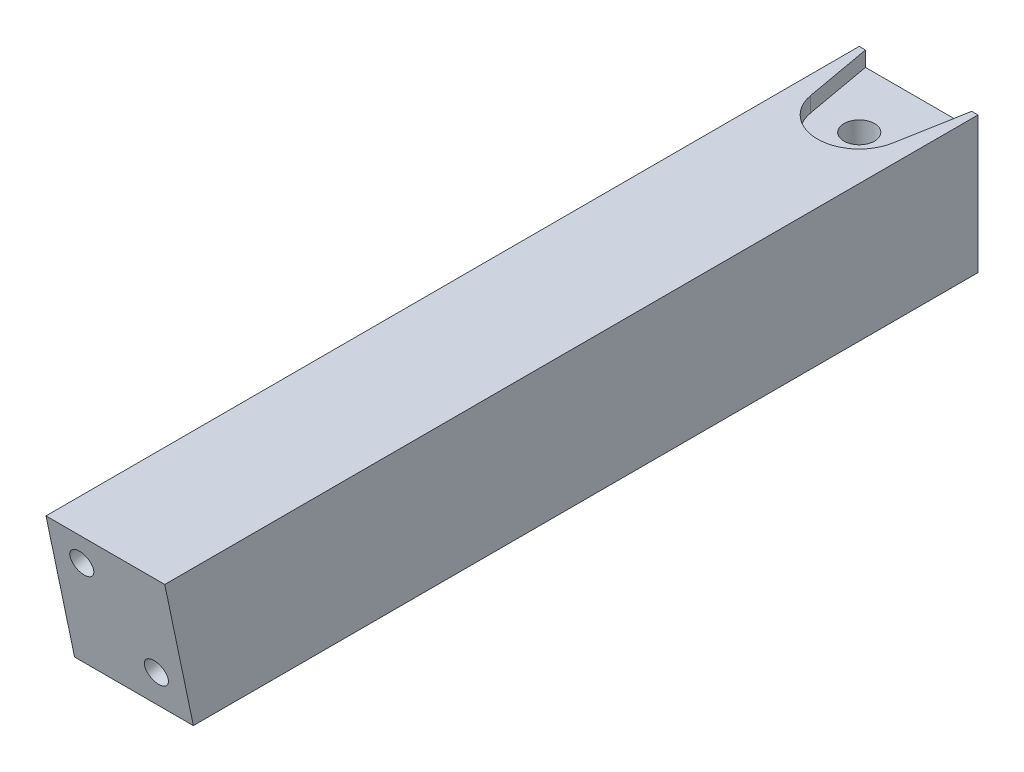
ISO-10303-21;
HEADER;
FILE_DESCRIPTION(('STEP AP214'),'2;1');
FILE_NAME('part.step','',(''),(''),'','','');
FILE_SCHEMA(('AUTOMOTIVE_DESIGN { 1 0 10303 214 1 1 1 1 }'));
ENDSEC;
DATA;
#1=APPLICATION_CONTEXT('core data for automotive mechanical design processes');
#2=APPLICATION_PROTOCOL_DEFINITION('international standard','automotive_design',2000,#1);
#3=PRODUCT_CONTEXT('',#1,'mechanical');
#4=PRODUCT('Part','Part','',(#3));
#5=PRODUCT_RELATED_PRODUCT_CATEGORY('part','',(#4));
#6=PRODUCT_DEFINITION_FORMATION('','',#4);
#7=PRODUCT_DEFINITION_CONTEXT('part definition',#1,'design');
#8=PRODUCT_DEFINITION('design','',#6,#7);
#9=PRODUCT_DEFINITION_SHAPE('','',#8);
#10=(LENGTH_UNIT() NAMED_UNIT(*) SI_UNIT(.MILLI.,.METRE.));
#11=(NAMED_UNIT(*) PLANE_ANGLE_UNIT() SI_UNIT($,.RADIAN.));
#12=(NAMED_UNIT(*) SI_UNIT($,.STERADIAN.) SOLID_ANGLE_UNIT());
#13=UNCERTAINTY_MEASURE_WITH_UNIT(LENGTH_MEASURE(1.E-05),#10,'distance_accuracy_value','');
#14=(GEOMETRIC_REPRESENTATION_CONTEXT(3) GLOBAL_UNCERTAINTY_ASSIGNED_CONTEXT((#13)) GLOBAL_UNIT_ASSIGNED_CONTEXT((#10,
#11,#12)) REPRESENTATION_CONTEXT('',''));
#15=CARTESIAN_POINT('',(0.,0.,0.));
#16=DIRECTION('',(0.,0.,1.));
#17=DIRECTION('',(1.,0.,0.));
#18=AXIS2_PLACEMENT_3D('',#15,#16,#17);
#19=CARTESIAN_POINT('',(12.7,14.605,197.296101601284));
#20=DIRECTION('',(0.,1.,0.));
#21=DIRECTION('',(-1.,0.,0.));
#22=AXIS2_PLACEMENT_3D('',#19,#20,#21);
#23=PLANE('',#22);
#24=DIRECTION('',(-0.176771623019133,0.,-0.984251895245918));
#25=VECTOR('',#24,1.);
#26=CARTESIAN_POINT('',(25.9239685293045,14.605,194.921077086757));
#27=LINE('',#26,#25);
#28=CARTESIAN_POINT('',(-8.7999993450147,14.605,1.58047972708946));
#29=VERTEX_POINT('',#28);
#30=CARTESIAN_POINT('',(-11.3647732520222,14.605,-12.7));
#31=VERTEX_POINT('',#30);
#32=EDGE_CURVE('E172',#29,#31,#27,.T.);
#33=ORIENTED_EDGE('',*,*,#32,.T.);
#34=DIRECTION('',(-1.,0.,0.));
#35=VECTOR('',#34,1.);
#36=CARTESIAN_POINT('',(12.7,14.605,-12.7));
#37=LINE('',#36,#35);
#38=CARTESIAN_POINT('',(-12.7,14.605,-12.7));
#39=VERTEX_POINT('',#38);
#40=EDGE_CURVE('E195',#31,#39,#37,.T.);
#41=ORIENTED_EDGE('',*,*,#40,.T.);
#42=DIRECTION('',(0.,0.,-1.));
#43=VECTOR('',#42,1.);
#44=CARTESIAN_POINT('',(-12.7,14.605,197.296101601284));
#45=LINE('',#44,#43);
#46=CARTESIAN_POINT('',(-12.7,14.605,161.22573442005));
#47=VERTEX_POINT('',#46);
#48=EDGE_CURVE('E207',#47,#39,#45,.T.);
#49=ORIENTED_EDGE('',*,*,#48,.F.);
#50=DIRECTION('',(-1.,0.,0.));
#51=VECTOR('',#50,1.);
#52=CARTESIAN_POINT('',(12.7,14.605,161.22573442005));
#53=LINE('',#52,#51);
#54=CARTESIAN_POINT('',(12.7,14.605,161.22573442005));
#55=VERTEX_POINT('',#54);
#56=EDGE_CURVE('E208',#55,#47,#53,.T.);
#57=ORIENTED_EDGE('',*,*,#56,.F.);
#58=DIRECTION('',(0.,0.,-1.));
#59=VECTOR('',#58,1.);
#60=CARTESIAN_POINT('',(12.7,14.605,197.296101601284));
#61=LINE('',#60,#59);
#62=CARTESIAN_POINT('',(12.7,14.605,-12.7));
#63=VERTEX_POINT('',#62);
#64=EDGE_CURVE('E211',#55,#63,#61,.T.);
#65=ORIENTED_EDGE('',*,*,#64,.T.);
#66=CARTESIAN_POINT('',(11.3647732520222,14.605,-12.7));
#67=VERTEX_POINT('',#66);
#68=EDGE_CURVE('E196',#63,#67,#37,.T.);
#69=ORIENTED_EDGE('',*,*,#68,.T.);
#70=DIRECTION('',(0.176771623019133,0.,-0.984251895245918));
#71=VECTOR('',#70,1.);
#72=CARTESIAN_POINT('',(-25.1302640790021,14.605,190.501786840207));
#73=LINE('',#72,#71);
#74=CARTESIAN_POINT('',(8.7999993450147,14.605,1.58047972708946));
#75=VERTEX_POINT('',#74);
#76=EDGE_CURVE('E164',#75,#67,#73,.T.);
#77=ORIENTED_EDGE('',*,*,#76,.F.);
#78=CARTESIAN_POINT('',(0.,14.605,0.));
#79=DIRECTION('',(0.,-1.,0.));
#80=DIRECTION('',(-1.,0.,0.));
#81=AXIS2_PLACEMENT_3D('',#78,#79,#80);
#82=CIRCLE('',#81,8.9408);
#83=EDGE_CURVE('E229',#29,#75,#82,.F.);
#84=ORIENTED_EDGE('',*,*,#83,.F.);
#85=EDGE_LOOP('',(#33,#41,#49,#57,#65,#69,#77,#84));
#86=FACE_BOUND('',#85,.T.);
#87=ADVANCED_FACE('F41',(#86),#23,.T.);
#88=CARTESIAN_POINT('',(233.303265585854,1008.96652745467,369.453578742917));
#89=DIRECTION('',(0.,-0.204962795312324,0.97876976482611));
#90=DIRECTION('',(0.,0.97876976482611,0.204962795312324));
#91=AXIS2_PLACEMENT_3D('',#88,#89,#90);
#92=PLANE('',#91);
#93=CARTESIAN_POINT('',(-6.35,8.3898119933542,159.924220669817));
#94=DIRECTION('',(0.,0.204962795312324,-0.97876976482611));
#95=DIRECTION('',(0.,0.97876976482611,0.204962795312324));
#96=AXIS2_PLACEMENT_3D('',#93,#94,#95);
#97=CIRCLE('',#96,2.52729999999989);
#98=CARTESIAN_POINT('',(-6.35,10.8634568199991,160.442223142409));
#99=VERTEX_POINT('',#98);
#100=EDGE_CURVE('E180',#99,#99,#97,.T.);
#101=ORIENTED_EDGE('',*,*,#100,.T.);
#102=EDGE_LOOP('',(#101));
#103=FACE_BOUND('',#102,.T.);
#104=CARTESIAN_POINT('',(6.35,-7.14815802326029,156.670436294233));
#105=DIRECTION('',(0.,0.204962795312324,-0.97876976482611));
#106=DIRECTION('',(0.,0.97876976482611,0.204962795312324));
#107=AXIS2_PLACEMENT_3D('',#104,#105,#106);
#108=CIRCLE('',#107,2.52729999999989);
#109=CARTESIAN_POINT('',(6.35,-4.67451319661537,157.188438766826));
#110=VERTEX_POINT('',#109);
#111=EDGE_CURVE('E183',#110,#110,#108,.T.);
#112=ORIENTED_EDGE('',*,*,#111,.T.);
#113=EDGE_LOOP('',(#112));
#114=FACE_BOUND('',#113,.T.);
#115=DIRECTION('',(0.,-0.97876976482611,-0.204962795312324));
#116=VECTOR('',#115,1.);
#117=CARTESIAN_POINT('',(-12.7,21.8411263885984,162.741041436204));
#118=LINE('',#117,#116);
#119=CARTESIAN_POINT('',(-12.7,-14.605,155.108909538218));
#120=VERTEX_POINT('',#119);
#121=EDGE_CURVE('E203',#47,#120,#118,.T.);
#122=ORIENTED_EDGE('',*,*,#121,.T.);
#123=DIRECTION('',(1.,0.,0.));
#124=VECTOR('',#123,1.);
#125=CARTESIAN_POINT('',(12.7,-14.605,155.108909538218));
#126=LINE('',#125,#124);
#127=CARTESIAN_POINT('',(12.7,-14.605,155.108909538218));
#128=VERTEX_POINT('',#127);
#129=EDGE_CURVE('E199',#120,#128,#126,.T.);
#130=ORIENTED_EDGE('',*,*,#129,.T.);
#131=DIRECTION('',(0.,0.97876976482611,0.204962795312324));
#132=VECTOR('',#131,1.);
#133=CARTESIAN_POINT('',(12.7,21.8411263885984,162.741041436204));
#134=LINE('',#133,#132);
#135=EDGE_CURVE('E212',#128,#55,#134,.T.);
#136=ORIENTED_EDGE('',*,*,#135,.T.);
#137=ORIENTED_EDGE('',*,*,#56,.T.);
#138=EDGE_LOOP('',(#122,#130,#136,#137));
#139=FACE_BOUND('',#138,.T.);
#140=ADVANCED_FACE('F43',(#103,#114,#139),#92,.T.);
#141=CARTESIAN_POINT('',(12.7,-14.605,197.296101601284));
#142=DIRECTION('',(0.,-1.,0.));
#143=DIRECTION('',(1.,0.,0.));
#144=AXIS2_PLACEMENT_3D('',#141,#142,#143);
#145=PLANE('',#144);
#146=DIRECTION('',(0.176771623019133,0.,-0.984251895245918));
#147=VECTOR('',#146,1.);
#148=CARTESIAN_POINT('',(-25.1302640790021,-14.605,190.501786840207));
#149=LINE('',#148,#147);
#150=CARTESIAN_POINT('',(8.7999993450147,-14.605,1.58047972708946));
#151=VERTEX_POINT('',#150);
#152=CARTESIAN_POINT('',(11.3647732520222,-14.605,-12.7));
#153=VERTEX_POINT('',#152);
#154=EDGE_CURVE('E133',#151,#153,#149,.T.);
#155=ORIENTED_EDGE('',*,*,#154,.T.);
#156=DIRECTION('',(1.,0.,0.));
#157=VECTOR('',#156,1.);
#158=CARTESIAN_POINT('',(12.7,-14.605,-12.7));
#159=LINE('',#158,#157);
#160=CARTESIAN_POINT('',(12.7,-14.605,-12.7));
#161=VERTEX_POINT('',#160);
#162=EDGE_CURVE('E189',#153,#161,#159,.T.);
#163=ORIENTED_EDGE('',*,*,#162,.T.);
#164=DIRECTION('',(0.,0.,-1.));
#165=VECTOR('',#164,1.);
#166=CARTESIAN_POINT('',(12.7,-14.605,197.296101601284));
#167=LINE('',#166,#165);
#168=EDGE_CURVE('E202',#128,#161,#167,.T.);
#169=ORIENTED_EDGE('',*,*,#168,.F.);
#170=ORIENTED_EDGE('',*,*,#129,.F.);
#171=DIRECTION('',(0.,0.,-1.));
#172=VECTOR('',#171,1.);
#173=CARTESIAN_POINT('',(-12.7,-14.605,197.296101601284));
#174=LINE('',#173,#172);
#175=CARTESIAN_POINT('',(-12.7,-14.605,-12.7));
#176=VERTEX_POINT('',#175);
#177=EDGE_CURVE('E206',#120,#176,#174,.T.);
#178=ORIENTED_EDGE('',*,*,#177,.T.);
#179=CARTESIAN_POINT('',(-11.3647732520222,-14.605,-12.7));
#180=VERTEX_POINT('',#179);
#181=EDGE_CURVE('E190',#176,#180,#159,.T.);
#182=ORIENTED_EDGE('',*,*,#181,.T.);
#183=DIRECTION('',(-0.176771623019133,0.,-0.984251895245918));
#184=VECTOR('',#183,1.);
#185=CARTESIAN_POINT('',(25.9239685293045,-14.605,194.921077086757));
#186=LINE('',#185,#184);
#187=CARTESIAN_POINT('',(-8.7999993450147,-14.605,1.58047972708946));
#188=VERTEX_POINT('',#187);
#189=EDGE_CURVE('E136',#188,#180,#186,.T.);
#190=ORIENTED_EDGE('',*,*,#189,.F.);
#191=CARTESIAN_POINT('',(0.,-14.605,0.));
#192=DIRECTION('',(0.,1.,0.));
#193=DIRECTION('',(1.,0.,0.));
#194=AXIS2_PLACEMENT_3D('',#191,#192,#193);
#195=CIRCLE('',#194,8.9408);
#196=EDGE_CURVE('E11',#188,#151,#195,.T.);
#197=ORIENTED_EDGE('',*,*,#196,.T.);
#198=EDGE_LOOP('',(#155,#163,#169,#170,#178,#182,#190,#197));
#199=FACE_BOUND('',#198,.T.);
#200=ADVANCED_FACE('F241',(#199),#145,.T.);
#201=CARTESIAN_POINT('',(12.7,14.605,197.296101601284));
#202=DIRECTION('',(1.,0.,0.));
#203=DIRECTION('',(0.,1.,0.));
#204=AXIS2_PLACEMENT_3D('',#201,#202,#203);
#205=PLANE('',#204);
#206=ORIENTED_EDGE('',*,*,#168,.T.);
#207=DIRECTION('',(0.,1.,0.));
#208=VECTOR('',#207,1.);
#209=CARTESIAN_POINT('',(12.7,14.605,-12.7));
#210=LINE('',#209,#208);
#211=EDGE_CURVE('E193',#161,#63,#210,.T.);
#212=ORIENTED_EDGE('',*,*,#211,.T.);
#213=ORIENTED_EDGE('',*,*,#64,.F.);
#214=ORIENTED_EDGE('',*,*,#135,.F.);
#215=EDGE_LOOP('',(#206,#212,#213,#214));
#216=FACE_BOUND('',#215,.T.);
#217=ADVANCED_FACE('F272',(#216),#205,.T.);
#218=CARTESIAN_POINT('',(-12.7,14.605,197.296101601284));
#219=DIRECTION('',(-1.,0.,0.));
#220=DIRECTION('',(0.,-1.,0.));
#221=AXIS2_PLACEMENT_3D('',#218,#219,#220);
#222=PLANE('',#221);
#223=ORIENTED_EDGE('',*,*,#48,.T.);
#224=DIRECTION('',(0.,-1.,0.));
#225=VECTOR('',#224,1.);
#226=CARTESIAN_POINT('',(-12.7,14.605,-12.7));
#227=LINE('',#226,#225);
#228=EDGE_CURVE('E179',#39,#176,#227,.T.);
#229=ORIENTED_EDGE('',*,*,#228,.T.);
#230=ORIENTED_EDGE('',*,*,#177,.F.);
#231=ORIENTED_EDGE('',*,*,#121,.F.);
#232=EDGE_LOOP('',(#223,#229,#230,#231));
#233=FACE_BOUND('',#232,.T.);
#234=ADVANCED_FACE('F250',(#233),#222,.T.);
#235=CARTESIAN_POINT('',(0.,0.,-12.7));
#236=DIRECTION('',(0.,0.,1.));
#237=DIRECTION('',(-1.,0.,0.));
#238=AXIS2_PLACEMENT_3D('',#235,#236,#237);
#239=PLANE('',#238);
#240=DIRECTION('',(1.,0.,0.));
#241=VECTOR('',#240,1.);
#242=CARTESIAN_POINT('',(0.,-11.3792,-12.7));
#243=LINE('',#242,#241);
#244=CARTESIAN_POINT('',(-11.3647732520222,-11.3792,-12.7));
#245=VERTEX_POINT('',#244);
#246=CARTESIAN_POINT('',(11.3647732520222,-11.3792,-12.7));
#247=VERTEX_POINT('',#246);
#248=EDGE_CURVE('E149',#245,#247,#243,.T.);
#249=ORIENTED_EDGE('',*,*,#248,.F.);
#250=DIRECTION('',(0.,-1.,0.));
#251=VECTOR('',#250,1.);
#252=CARTESIAN_POINT('',(-11.3647732520222,0.,-12.7));
#253=LINE('',#252,#251);
#254=EDGE_CURVE('E233',#245,#180,#253,.T.);
#255=ORIENTED_EDGE('',*,*,#254,.T.);
#256=ORIENTED_EDGE('',*,*,#181,.F.);
#257=ORIENTED_EDGE('',*,*,#228,.F.);
#258=ORIENTED_EDGE('',*,*,#40,.F.);
#259=DIRECTION('',(0.,1.,0.));
#260=VECTOR('',#259,1.);
#261=CARTESIAN_POINT('',(-11.3647732520222,0.,-12.7));
#262=LINE('',#261,#260);
#263=CARTESIAN_POINT('',(-11.3647732520222,11.3792,-12.7));
#264=VERTEX_POINT('',#263);
#265=EDGE_CURVE('E227',#264,#31,#262,.T.);
#266=ORIENTED_EDGE('',*,*,#265,.F.);
#267=DIRECTION('',(1.,0.,0.));
#268=VECTOR('',#267,1.);
#269=CARTESIAN_POINT('',(0.,11.3792,-12.7));
#270=LINE('',#269,#268);
#271=CARTESIAN_POINT('',(11.3647732520222,11.3792,-12.7));
#272=VERTEX_POINT('',#271);
#273=EDGE_CURVE('E222',#264,#272,#270,.T.);
#274=ORIENTED_EDGE('',*,*,#273,.T.);
#275=DIRECTION('',(0.,1.,0.));
#276=VECTOR('',#275,1.);
#277=CARTESIAN_POINT('',(11.3647732520222,0.,-12.7));
#278=LINE('',#277,#276);
#279=EDGE_CURVE('E225',#272,#67,#278,.T.);
#280=ORIENTED_EDGE('',*,*,#279,.T.);
#281=ORIENTED_EDGE('',*,*,#68,.F.);
#282=ORIENTED_EDGE('',*,*,#211,.F.);
#283=ORIENTED_EDGE('',*,*,#162,.F.);
#284=DIRECTION('',(0.,-1.,0.));
#285=VECTOR('',#284,1.);
#286=CARTESIAN_POINT('',(11.3647732520222,0.,-12.7));
#287=LINE('',#286,#285);
#288=EDGE_CURVE('E50',#247,#153,#287,.T.);
#289=ORIENTED_EDGE('',*,*,#288,.F.);
#290=EDGE_LOOP('',(#249,#255,#256,#257,#258,#266,#274,#280,#281,#282,#283,#289));
#291=FACE_BOUND('',#290,.T.);
#292=ADVANCED_FACE('F238',(#291),#239,.F.);
#293=CARTESIAN_POINT('',(6.35000000000002,-3.89437364767715,141.132466277619));
#294=DIRECTION('',(0.,-0.204962795312324,0.97876976482611));
#295=DIRECTION('',(0.,0.97876976482611,0.204962795312324));
#296=AXIS2_PLACEMENT_3D('',#293,#294,#295);
#297=CYLINDRICAL_SURFACE('',#296,2.52729999999989);
#298=CARTESIAN_POINT('',(6.35000000000002,-3.89437364767715,141.132466277619));
#299=DIRECTION('',(0.,0.204962795312324,-0.97876976482611));
#300=DIRECTION('',(0.,0.97876976482611,0.204962795312324));
#301=AXIS2_PLACEMENT_3D('',#298,#299,#300);
#302=CIRCLE('',#301,2.52729999999989);
#303=CARTESIAN_POINT('',(6.35000000000002,-1.42072882103223,141.650468750212));
#304=VERTEX_POINT('',#303);
#305=EDGE_CURVE('E175',#304,#304,#302,.T.);
#306=ORIENTED_EDGE('',*,*,#305,.T.);
#307=EDGE_LOOP('',(#306));
#308=FACE_BOUND('',#307,.T.);
#309=ORIENTED_EDGE('',*,*,#111,.F.);
#310=EDGE_LOOP('',(#309));
#311=FACE_BOUND('',#310,.T.);
#312=ADVANCED_FACE('F285',(#308,#311),#297,.F.);
#313=CARTESIAN_POINT('',(6.35000000000002,-3.89437364767715,141.132466277619));
#314=DIRECTION('',(0.,-0.204962795312324,0.97876976482611));
#315=DIRECTION('',(0.,0.97876976482611,0.204962795312324));
#316=AXIS2_PLACEMENT_3D('',#313,#314,#315);
#317=PLANE('',#316);
#318=ORIENTED_EDGE('',*,*,#305,.F.);
#319=EDGE_LOOP('',(#318));
#320=FACE_BOUND('',#319,.T.);
#321=ADVANCED_FACE('F287',(#320),#317,.T.);
#322=CARTESIAN_POINT('',(-6.34999999999999,11.6435963689373,144.386250653202));
#323=DIRECTION('',(0.,-0.204962795312324,0.97876976482611));
#324=DIRECTION('',(0.,0.97876976482611,0.204962795312324));
#325=AXIS2_PLACEMENT_3D('',#322,#323,#324);
#326=CYLINDRICAL_SURFACE('',#325,2.52729999999989);
#327=CARTESIAN_POINT('',(-6.34999999999999,11.6435963689373,144.386250653202));
#328=DIRECTION('',(0.,0.204962795312324,-0.97876976482611));
#329=DIRECTION('',(0.,0.97876976482611,0.204962795312324));
#330=AXIS2_PLACEMENT_3D('',#327,#328,#329);
#331=CIRCLE('',#330,2.52729999999989);
#332=CARTESIAN_POINT('',(-6.34999999999999,14.1172411955823,144.904253125795));
#333=VERTEX_POINT('',#332);
#334=EDGE_CURVE('E176',#333,#333,#331,.T.);
#335=ORIENTED_EDGE('',*,*,#334,.T.);
#336=EDGE_LOOP('',(#335));
#337=FACE_BOUND('',#336,.T.);
#338=ORIENTED_EDGE('',*,*,#100,.F.);
#339=EDGE_LOOP('',(#338));
#340=FACE_BOUND('',#339,.T.);
#341=ADVANCED_FACE('F294',(#337,#340),#326,.F.);
#342=CARTESIAN_POINT('',(-6.34999999999999,11.6435963689373,144.386250653202));
#343=DIRECTION('',(0.,-0.204962795312324,0.97876976482611));
#344=DIRECTION('',(0.,0.97876976482611,0.204962795312324));
#345=AXIS2_PLACEMENT_3D('',#342,#343,#344);
#346=PLANE('',#345);
#347=ORIENTED_EDGE('',*,*,#334,.F.);
#348=EDGE_LOOP('',(#347));
#349=FACE_BOUND('',#348,.T.);
#350=ADVANCED_FACE('F340',(#349),#346,.T.);
#351=CARTESIAN_POINT('',(0.,11.3792,0.));
#352=DIRECTION('',(0.,1.,0.));
#353=DIRECTION('',(0.,0.,1.));
#354=AXIS2_PLACEMENT_3D('',#351,#352,#353);
#355=PLANE('',#354);
#356=CARTESIAN_POINT('',(0.,11.3792,0.));
#357=DIRECTION('',(0.,-1.,0.));
#358=DIRECTION('',(0.,0.,-1.));
#359=AXIS2_PLACEMENT_3D('',#356,#357,#358);
#360=CIRCLE('',#359,3.2639);
#361=CARTESIAN_POINT('',(-3.2639,11.3792,0.));
#362=VERTEX_POINT('',#361);
#363=EDGE_CURVE('E155',#362,#362,#360,.T.);
#364=ORIENTED_EDGE('',*,*,#363,.T.);
#365=EDGE_LOOP('',(#364));
#366=FACE_BOUND('',#365,.T.);
#367=ORIENTED_EDGE('',*,*,#273,.F.);
#368=DIRECTION('',(-0.176771623019133,0.,-0.984251895245918));
#369=VECTOR('',#368,1.);
#370=CARTESIAN_POINT('',(-8.7999993450147,11.3792,1.58047972708946));
#371=LINE('',#370,#369);
#372=CARTESIAN_POINT('',(-8.7999993450147,11.3792,1.58047972708946));
#373=VERTEX_POINT('',#372);
#374=EDGE_CURVE('E65',#373,#264,#371,.T.);
#375=ORIENTED_EDGE('',*,*,#374,.F.);
#376=CARTESIAN_POINT('',(0.,11.3792,0.));
#377=DIRECTION('',(0.,-1.,0.));
#378=DIRECTION('',(0.,0.,-1.));
#379=AXIS2_PLACEMENT_3D('',#376,#377,#378);
#380=CIRCLE('',#379,8.9408);
#381=CARTESIAN_POINT('',(8.7999993450147,11.3792,1.58047972708946));
#382=VERTEX_POINT('',#381);
#383=EDGE_CURVE('E159',#373,#382,#380,.F.);
#384=ORIENTED_EDGE('',*,*,#383,.T.);
#385=DIRECTION('',(0.176771623019133,0.,-0.984251895245918));
#386=VECTOR('',#385,1.);
#387=CARTESIAN_POINT('',(8.7999993450147,11.3792,1.58047972708946));
#388=LINE('',#387,#386);
#389=EDGE_CURVE('E162',#382,#272,#388,.T.);
#390=ORIENTED_EDGE('',*,*,#389,.T.);
#391=EDGE_LOOP('',(#367,#375,#384,#390));
#392=FACE_BOUND('',#391,.T.);
#393=ADVANCED_FACE('F264',(#366,#392),#355,.T.);
#394=CARTESIAN_POINT('',(-8.7999993450147,14.605,1.58047972708946));
#395=DIRECTION('',(-0.984251895245918,0.,0.176771623019133));
#396=DIRECTION('',(0.176771623019133,0.,0.984251895245918));
#397=AXIS2_PLACEMENT_3D('',#394,#395,#396);
#398=PLANE('',#397);
#399=ORIENTED_EDGE('',*,*,#32,.F.);
#400=DIRECTION('',(0.,-1.,0.));
#401=VECTOR('',#400,1.);
#402=CARTESIAN_POINT('',(-8.7999993450147,14.605,1.58047972708946));
#403=LINE('',#402,#401);
#404=EDGE_CURVE('E160',#29,#373,#403,.T.);
#405=ORIENTED_EDGE('',*,*,#404,.T.);
#406=ORIENTED_EDGE('',*,*,#374,.T.);
#407=ORIENTED_EDGE('',*,*,#265,.T.);
#408=EDGE_LOOP('',(#399,#405,#406,#407));
#409=FACE_BOUND('',#408,.T.);
#410=ADVANCED_FACE('F258',(#409),#398,.F.);
#411=CARTESIAN_POINT('',(0.,14.605,0.));
#412=DIRECTION('',(0.,-1.,0.));
#413=DIRECTION('',(0.,0.,-1.));
#414=AXIS2_PLACEMENT_3D('',#411,#412,#413);
#415=CYLINDRICAL_SURFACE('',#414,8.9408);
#416=ORIENTED_EDGE('',*,*,#404,.F.);
#417=ORIENTED_EDGE('',*,*,#83,.T.);
#418=DIRECTION('',(0.,-1.,0.));
#419=VECTOR('',#418,1.);
#420=CARTESIAN_POINT('',(8.7999993450147,14.605,1.58047972708946));
#421=LINE('',#420,#419);
#422=EDGE_CURVE('E165',#75,#382,#421,.T.);
#423=ORIENTED_EDGE('',*,*,#422,.T.);
#424=ORIENTED_EDGE('',*,*,#383,.F.);
#425=EDGE_LOOP('',(#416,#417,#423,#424));
#426=FACE_BOUND('',#425,.T.);
#427=ADVANCED_FACE('F261',(#426),#415,.F.);
#428=CARTESIAN_POINT('',(8.7999993450147,14.605,1.58047972708946));
#429=DIRECTION('',(-0.984251895245918,0.,-0.176771623019133));
#430=DIRECTION('',(-0.176771623019133,0.,0.984251895245918));
#431=AXIS2_PLACEMENT_3D('',#428,#429,#430);
#432=PLANE('',#431);
#433=ORIENTED_EDGE('',*,*,#422,.F.);
#434=ORIENTED_EDGE('',*,*,#76,.T.);
#435=ORIENTED_EDGE('',*,*,#279,.F.);
#436=ORIENTED_EDGE('',*,*,#389,.F.);
#437=EDGE_LOOP('',(#433,#434,#435,#436));
#438=FACE_BOUND('',#437,.T.);
#439=ADVANCED_FACE('F267',(#438),#432,.T.);
#440=CARTESIAN_POINT('',(0.,-11.3792,0.));
#441=DIRECTION('',(0.,1.,0.));
#442=DIRECTION('',(0.,0.,1.));
#443=AXIS2_PLACEMENT_3D('',#440,#441,#442);
#444=PLANE('',#443);
#445=CARTESIAN_POINT('',(0.,-11.3792,0.));
#446=DIRECTION('',(0.,-1.,0.));
#447=DIRECTION('',(0.,0.,-1.));
#448=AXIS2_PLACEMENT_3D('',#445,#446,#447);
#449=CIRCLE('',#448,3.2639);
#450=CARTESIAN_POINT('',(-3.2639,-11.3792,0.));
#451=VERTEX_POINT('',#450);
#452=EDGE_CURVE('E45',#451,#451,#449,.T.);
#453=ORIENTED_EDGE('',*,*,#452,.F.);
#454=EDGE_LOOP('',(#453));
#455=FACE_BOUND('',#454,.T.);
#456=DIRECTION('',(-0.176771623019133,0.,-0.984251895245918));
#457=VECTOR('',#456,1.);
#458=CARTESIAN_POINT('',(-8.7999993450147,-11.3792,1.58047972708946));
#459=LINE('',#458,#457);
#460=CARTESIAN_POINT('',(-8.7999993450147,-11.3792,1.58047972708946));
#461=VERTEX_POINT('',#460);
#462=EDGE_CURVE('E144',#461,#245,#459,.T.);
#463=ORIENTED_EDGE('',*,*,#462,.T.);
#464=ORIENTED_EDGE('',*,*,#248,.T.);
#465=DIRECTION('',(0.176771623019133,0.,-0.984251895245918));
#466=VECTOR('',#465,1.);
#467=CARTESIAN_POINT('',(8.7999993450147,-11.3792,1.58047972708946));
#468=LINE('',#467,#466);
#469=CARTESIAN_POINT('',(8.7999993450147,-11.3792,1.58047972708946));
#470=VERTEX_POINT('',#469);
#471=EDGE_CURVE('E57',#470,#247,#468,.T.);
#472=ORIENTED_EDGE('',*,*,#471,.F.);
#473=CARTESIAN_POINT('',(0.,-11.3792,0.));
#474=DIRECTION('',(0.,-1.,0.));
#475=DIRECTION('',(0.,0.,-1.));
#476=AXIS2_PLACEMENT_3D('',#473,#474,#475);
#477=CIRCLE('',#476,8.9408);
#478=EDGE_CURVE('E140',#461,#470,#477,.F.);
#479=ORIENTED_EDGE('',*,*,#478,.F.);
#480=EDGE_LOOP('',(#463,#464,#472,#479));
#481=FACE_BOUND('',#480,.T.);
#482=ADVANCED_FACE('F147',(#455,#481),#444,.F.);
#483=CARTESIAN_POINT('',(8.7999993450147,-14.605,1.58047972708946));
#484=DIRECTION('',(0.984251895245918,0.,0.176771623019133));
#485=DIRECTION('',(0.176771623019133,0.,-0.984251895245918));
#486=AXIS2_PLACEMENT_3D('',#483,#484,#485);
#487=PLANE('',#486);
#488=ORIENTED_EDGE('',*,*,#154,.F.);
#489=DIRECTION('',(0.,-1.,0.));
#490=VECTOR('',#489,1.);
#491=CARTESIAN_POINT('',(8.7999993450147,-14.605,1.58047972708946));
#492=LINE('',#491,#490);
#493=EDGE_CURVE('E129',#151,#470,#492,.F.);
#494=ORIENTED_EDGE('',*,*,#493,.T.);
#495=ORIENTED_EDGE('',*,*,#471,.T.);
#496=ORIENTED_EDGE('',*,*,#288,.T.);
#497=EDGE_LOOP('',(#488,#494,#495,#496));
#498=FACE_BOUND('',#497,.T.);
#499=ADVANCED_FACE('F131',(#498),#487,.F.);
#500=CARTESIAN_POINT('',(0.,-14.605,0.));
#501=DIRECTION('',(0.,1.,0.));
#502=DIRECTION('',(0.,0.,1.));
#503=AXIS2_PLACEMENT_3D('',#500,#501,#502);
#504=CYLINDRICAL_SURFACE('',#503,8.9408);
#505=ORIENTED_EDGE('',*,*,#196,.F.);
#506=DIRECTION('',(0.,1.,0.));
#507=VECTOR('',#506,1.);
#508=CARTESIAN_POINT('',(-8.7999993450147,-14.605,1.58047972708946));
#509=LINE('',#508,#507);
#510=EDGE_CURVE('E137',#188,#461,#509,.T.);
#511=ORIENTED_EDGE('',*,*,#510,.T.);
#512=ORIENTED_EDGE('',*,*,#478,.T.);
#513=ORIENTED_EDGE('',*,*,#493,.F.);
#514=EDGE_LOOP('',(#505,#511,#512,#513));
#515=FACE_BOUND('',#514,.T.);
#516=ADVANCED_FACE('F141',(#515),#504,.F.);
#517=CARTESIAN_POINT('',(-8.7999993450147,-14.605,1.58047972708946));
#518=DIRECTION('',(0.984251895245918,0.,-0.176771623019133));
#519=DIRECTION('',(-0.176771623019133,0.,-0.984251895245918));
#520=AXIS2_PLACEMENT_3D('',#517,#518,#519);
#521=PLANE('',#520);
#522=ORIENTED_EDGE('',*,*,#510,.F.);
#523=ORIENTED_EDGE('',*,*,#189,.T.);
#524=ORIENTED_EDGE('',*,*,#254,.F.);
#525=ORIENTED_EDGE('',*,*,#462,.F.);
#526=EDGE_LOOP('',(#522,#523,#524,#525));
#527=FACE_BOUND('',#526,.T.);
#528=ADVANCED_FACE('F246',(#527),#521,.T.);
#529=CARTESIAN_POINT('',(0.,-14.605,0.));
#530=DIRECTION('',(0.,1.,0.));
#531=DIRECTION('',(-1.,0.,0.));
#532=AXIS2_PLACEMENT_3D('',#529,#530,#531);
#533=CYLINDRICAL_SURFACE('',#532,3.2639);
#534=CARTESIAN_POINT('',(-3.2639,11.3792,0.));
#535=CARTESIAN_POINT('',(-3.2639,11.1421333333333,0.));
#536=CARTESIAN_POINT('',(-3.2639,10.9050666666667,0.));
#537=CARTESIAN_POINT('',(-3.2639,10.4309333333333,0.));
#538=CARTESIAN_POINT('',(-3.2639,10.1938666666667,0.));
#539=CARTESIAN_POINT('',(-3.2639,9.71973333333334,0.));
#540=CARTESIAN_POINT('',(-3.2639,9.48266666666667,0.));
#541=CARTESIAN_POINT('',(-3.2639,9.00853333333334,0.));
#542=CARTESIAN_POINT('',(-3.2639,8.77146666666667,0.));
#543=CARTESIAN_POINT('',(-3.2639,8.29733333333334,0.));
#544=CARTESIAN_POINT('',(-3.2639,8.06026666666667,0.));
#545=CARTESIAN_POINT('',(-3.2639,7.58613333333334,0.));
#546=CARTESIAN_POINT('',(-3.2639,7.34906666666667,0.));
#547=CARTESIAN_POINT('',(-3.2639,6.87493333333334,0.));
#548=CARTESIAN_POINT('',(-3.2639,6.63786666666667,0.));
#549=CARTESIAN_POINT('',(-3.2639,6.16373333333334,0.));
#550=CARTESIAN_POINT('',(-3.2639,5.92666666666667,0.));
#551=CARTESIAN_POINT('',(-3.2639,5.45253333333334,0.));
#552=CARTESIAN_POINT('',(-3.2639,5.21546666666667,0.));
#553=CARTESIAN_POINT('',(-3.2639,4.74133333333334,0.));
#554=CARTESIAN_POINT('',(-3.2639,4.50426666666667,0.));
#555=CARTESIAN_POINT('',(-3.2639,4.03013333333334,0.));
#556=CARTESIAN_POINT('',(-3.2639,3.79306666666667,0.));
#557=CARTESIAN_POINT('',(-3.2639,3.31893333333334,0.));
#558=CARTESIAN_POINT('',(-3.2639,3.08186666666667,0.));
#559=CARTESIAN_POINT('',(-3.2639,2.60773333333334,0.));
#560=CARTESIAN_POINT('',(-3.2639,2.37066666666667,0.));
#561=CARTESIAN_POINT('',(-3.2639,1.89653333333334,0.));
#562=CARTESIAN_POINT('',(-3.2639,1.65946666666667,0.));
#563=CARTESIAN_POINT('',(-3.2639,1.18533333333334,0.));
#564=CARTESIAN_POINT('',(-3.2639,0.94826666666667,0.));
#565=CARTESIAN_POINT('',(-3.2639,0.474133333333337,0.));
#566=CARTESIAN_POINT('',(-3.2639,0.23706666666667,0.));
#567=CARTESIAN_POINT('',(-3.2639,-0.237066666666663,0.));
#568=CARTESIAN_POINT('',(-3.2639,-0.47413333333333,0.));
#569=CARTESIAN_POINT('',(-3.2639,-0.948266666666664,0.));
#570=CARTESIAN_POINT('',(-3.2639,-1.18533333333333,0.));
#571=CARTESIAN_POINT('',(-3.2639,-1.65946666666666,0.));
#572=CARTESIAN_POINT('',(-3.2639,-1.89653333333333,0.));
#573=CARTESIAN_POINT('',(-3.2639,-2.37066666666666,0.));
#574=CARTESIAN_POINT('',(-3.2639,-2.60773333333333,0.));
#575=CARTESIAN_POINT('',(-3.2639,-3.08186666666666,0.));
#576=CARTESIAN_POINT('',(-3.2639,-3.31893333333333,0.));
#577=CARTESIAN_POINT('',(-3.2639,-3.79306666666666,0.));
#578=CARTESIAN_POINT('',(-3.2639,-4.03013333333333,0.));
#579=CARTESIAN_POINT('',(-3.2639,-4.50426666666667,0.));
#580=CARTESIAN_POINT('',(-3.2639,-4.74133333333333,0.));
#581=CARTESIAN_POINT('',(-3.2639,-5.21546666666666,0.));
#582=CARTESIAN_POINT('',(-3.2639,-5.45253333333333,0.));
#583=CARTESIAN_POINT('',(-3.2639,-5.92666666666666,0.));
#584=CARTESIAN_POINT('',(-3.2639,-6.16373333333333,0.));
#585=CARTESIAN_POINT('',(-3.2639,-6.63786666666666,0.));
#586=CARTESIAN_POINT('',(-3.2639,-6.87493333333333,0.));
#587=CARTESIAN_POINT('',(-3.2639,-7.34906666666666,0.));
#588=CARTESIAN_POINT('',(-3.2639,-7.58613333333333,0.));
#589=CARTESIAN_POINT('',(-3.2639,-8.06026666666667,0.));
#590=CARTESIAN_POINT('',(-3.2639,-8.29733333333333,0.));
#591=CARTESIAN_POINT('',(-3.2639,-8.77146666666667,0.));
#592=CARTESIAN_POINT('',(-3.2639,-9.00853333333333,0.));
#593=CARTESIAN_POINT('',(-3.2639,-9.48266666666667,0.));
#594=CARTESIAN_POINT('',(-3.2639,-9.71973333333333,0.));
#595=CARTESIAN_POINT('',(-3.2639,-10.1938666666667,0.));
#596=CARTESIAN_POINT('',(-3.2639,-10.4309333333333,0.));
#597=CARTESIAN_POINT('',(-3.2639,-10.9050666666667,0.));
#598=CARTESIAN_POINT('',(-3.2639,-11.1421333333333,0.));
#599=CARTESIAN_POINT('',(-3.2639,-11.3792,0.));
#600=B_SPLINE_CURVE_WITH_KNOTS('',3,(#534,#535,#536,#537,#538,#539,#540,#541,#542,#543,#544,
#545,#546,#547,#548,#549,#550,#551,#552,#553,#554,#555,#556,#557,#558,#559,#560,#561,#562,#563,
#564,#565,#566,#567,#568,#569,#570,#571,#572,#573,#574,#575,#576,#577,#578,#579,#580,#581,#582,
#583,#584,#585,#586,#587,#588,#589,#590,#591,#592,#593,#594,#595,#596,#597,#598,#599),
.UNSPECIFIED.,.F.,.F.,(4,2,2,2,2,2,2,2,2,2,2,2,2,2,2,2,2,2,2,2,2,2,2,2,2,2,2,2,2,2,2,2,4),(0.,
0.711199999999999,1.4224,2.1336,2.8448,3.556,4.2672,4.9784,5.6896,6.4008,7.112,7.8232,8.5344,
9.2456,9.9568,10.668,11.3792,12.0904,12.8016,13.5128,14.224,14.9352,15.6464,16.3576,17.0688,
17.78,18.4912,19.2024,19.9136,20.6248,21.336,22.0472,22.7584),.UNSPECIFIED.);
#601=EDGE_CURVE('BSEAM428',#362,#451,#600,.T.);
#602=ORIENTED_EDGE('',*,*,#363,.F.);
#603=ORIENTED_EDGE('',*,*,#452,.T.);
#604=ORIENTED_EDGE('',*,*,#601,.T.);
#605=ORIENTED_EDGE('',*,*,#601,.F.);
#606=EDGE_LOOP('',(#602,#604,#603,#605));
#607=FACE_BOUND('',#606,.T.);
#608=ADVANCED_FACE('F428',(#607),#533,.F.);
#609=CLOSED_SHELL('',(#87,#140,#200,#217,#234,#292,#312,#321,#341,#350,#393,#410,#427,#439,#482,
#499,#516,#528,#608));
#610=MANIFOLD_SOLID_BREP('B2',#609);
#611=ADVANCED_BREP_SHAPE_REPRESENTATION('',(#18,#610),#14);
#612=SHAPE_DEFINITION_REPRESENTATION(#9,#611);
ENDSEC;
END-ISO-10303-21;
